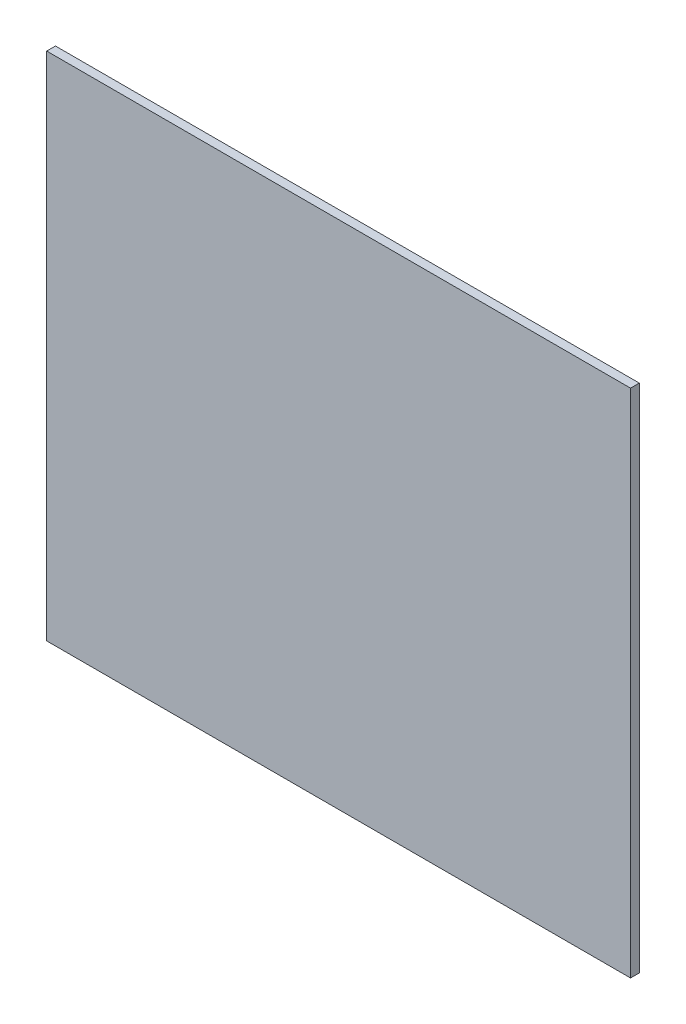
ISO-10303-21;
HEADER;
FILE_DESCRIPTION(('STEP AP214'),'2;1');
FILE_NAME('part.step','',(''),(''),'','','');
FILE_SCHEMA(('AUTOMOTIVE_DESIGN { 1 0 10303 214 1 1 1 1 }'));
ENDSEC;
DATA;
#1=APPLICATION_CONTEXT('core data for automotive mechanical design processes');
#2=APPLICATION_PROTOCOL_DEFINITION('international standard','automotive_design',2000,#1);
#3=PRODUCT_CONTEXT('',#1,'mechanical');
#4=PRODUCT('Part','Part','',(#3));
#5=PRODUCT_RELATED_PRODUCT_CATEGORY('part','',(#4));
#6=PRODUCT_DEFINITION_FORMATION('','',#4);
#7=PRODUCT_DEFINITION_CONTEXT('part definition',#1,'design');
#8=PRODUCT_DEFINITION('design','',#6,#7);
#9=PRODUCT_DEFINITION_SHAPE('','',#8);
#10=(LENGTH_UNIT() NAMED_UNIT(*) SI_UNIT(.MILLI.,.METRE.));
#11=(NAMED_UNIT(*) PLANE_ANGLE_UNIT() SI_UNIT($,.RADIAN.));
#12=(NAMED_UNIT(*) SI_UNIT($,.STERADIAN.) SOLID_ANGLE_UNIT());
#13=UNCERTAINTY_MEASURE_WITH_UNIT(LENGTH_MEASURE(1.E-05),#10,'distance_accuracy_value','');
#14=(GEOMETRIC_REPRESENTATION_CONTEXT(3) GLOBAL_UNCERTAINTY_ASSIGNED_CONTEXT((#13)) GLOBAL_UNIT_ASSIGNED_CONTEXT((#10,
#11,#12)) REPRESENTATION_CONTEXT('',''));
#15=CARTESIAN_POINT('',(0.,0.,0.));
#16=DIRECTION('',(0.,0.,1.));
#17=DIRECTION('',(1.,0.,0.));
#18=AXIS2_PLACEMENT_3D('',#15,#16,#17);
#19=CARTESIAN_POINT('',(0.,0.,0.));
#20=DIRECTION('',(0.,0.,1.));
#21=DIRECTION('',(1.,0.,0.));
#22=AXIS2_PLACEMENT_3D('',#19,#20,#21);
#23=PLANE('',#22);
#24=DIRECTION('',(1.,0.,0.));
#25=VECTOR('',#24,1.);
#26=CARTESIAN_POINT('',(-100.,-87.5,0.));
#27=LINE('',#26,#25);
#28=CARTESIAN_POINT('',(-100.,-87.5,0.));
#29=VERTEX_POINT('',#28);
#30=CARTESIAN_POINT('',(100.,-87.5,0.));
#31=VERTEX_POINT('',#30);
#32=EDGE_CURVE('E25',#29,#31,#27,.T.);
#33=ORIENTED_EDGE('',*,*,#32,.F.);
#34=DIRECTION('',(0.,-1.,0.));
#35=VECTOR('',#34,1.);
#36=CARTESIAN_POINT('',(-100.,87.5,0.));
#37=LINE('',#36,#35);
#38=CARTESIAN_POINT('',(-100.,87.5,0.));
#39=VERTEX_POINT('',#38);
#40=EDGE_CURVE('E86',#39,#29,#37,.T.);
#41=ORIENTED_EDGE('',*,*,#40,.F.);
#42=DIRECTION('',(-1.,0.,0.));
#43=VECTOR('',#42,1.);
#44=CARTESIAN_POINT('',(100.,87.5,0.));
#45=LINE('',#44,#43);
#46=CARTESIAN_POINT('',(100.,87.5,0.));
#47=VERTEX_POINT('',#46);
#48=EDGE_CURVE('E69',#47,#39,#45,.T.);
#49=ORIENTED_EDGE('',*,*,#48,.F.);
#50=DIRECTION('',(0.,1.,0.));
#51=VECTOR('',#50,1.);
#52=CARTESIAN_POINT('',(100.,-87.5,0.));
#53=LINE('',#52,#51);
#54=EDGE_CURVE('E115',#31,#47,#53,.T.);
#55=ORIENTED_EDGE('',*,*,#54,.F.);
#56=EDGE_LOOP('',(#33,#41,#49,#55));
#57=FACE_BOUND('',#56,.T.);
#58=ADVANCED_FACE('F17',(#57),#23,.F.);
#59=CARTESIAN_POINT('',(0.,0.,3.));
#60=DIRECTION('',(0.,0.,1.));
#61=DIRECTION('',(1.,0.,0.));
#62=AXIS2_PLACEMENT_3D('',#59,#60,#61);
#63=PLANE('',#62);
#64=DIRECTION('',(1.,0.,0.));
#65=VECTOR('',#64,1.);
#66=CARTESIAN_POINT('',(-100.,-87.5,3.));
#67=LINE('',#66,#65);
#68=CARTESIAN_POINT('',(-100.,-87.5,3.));
#69=VERTEX_POINT('',#68);
#70=CARTESIAN_POINT('',(100.,-87.5,3.));
#71=VERTEX_POINT('',#70);
#72=EDGE_CURVE('E11',#69,#71,#67,.T.);
#73=ORIENTED_EDGE('',*,*,#72,.T.);
#74=DIRECTION('',(0.,1.,0.));
#75=VECTOR('',#74,1.);
#76=CARTESIAN_POINT('',(100.,-87.5,3.));
#77=LINE('',#76,#75);
#78=CARTESIAN_POINT('',(100.,87.5,3.));
#79=VERTEX_POINT('',#78);
#80=EDGE_CURVE('E108',#71,#79,#77,.T.);
#81=ORIENTED_EDGE('',*,*,#80,.T.);
#82=DIRECTION('',(-1.,0.,0.));
#83=VECTOR('',#82,1.);
#84=CARTESIAN_POINT('',(100.,87.5,3.));
#85=LINE('',#84,#83);
#86=CARTESIAN_POINT('',(-100.,87.5,3.));
#87=VERTEX_POINT('',#86);
#88=EDGE_CURVE('E85',#79,#87,#85,.T.);
#89=ORIENTED_EDGE('',*,*,#88,.T.);
#90=DIRECTION('',(0.,-1.,0.));
#91=VECTOR('',#90,1.);
#92=CARTESIAN_POINT('',(-100.,87.5,3.));
#93=LINE('',#92,#91);
#94=EDGE_CURVE('E90',#87,#69,#93,.T.);
#95=ORIENTED_EDGE('',*,*,#94,.T.);
#96=EDGE_LOOP('',(#73,#81,#89,#95));
#97=FACE_BOUND('',#96,.T.);
#98=ADVANCED_FACE('F119',(#97),#63,.T.);
#99=CARTESIAN_POINT('',(-100.,-87.5,0.));
#100=DIRECTION('',(0.,-1.,0.));
#101=DIRECTION('',(-1.,0.,0.));
#102=AXIS2_PLACEMENT_3D('',#99,#100,#101);
#103=PLANE('',#102);
#104=ORIENTED_EDGE('',*,*,#32,.T.);
#105=DIRECTION('',(0.,0.,1.));
#106=VECTOR('',#105,1.);
#107=CARTESIAN_POINT('',(100.,-87.5,0.));
#108=LINE('',#107,#106);
#109=EDGE_CURVE('E106',#31,#71,#108,.T.);
#110=ORIENTED_EDGE('',*,*,#109,.T.);
#111=ORIENTED_EDGE('',*,*,#72,.F.);
#112=DIRECTION('',(0.,0.,1.));
#113=VECTOR('',#112,1.);
#114=CARTESIAN_POINT('',(-100.,-87.5,0.));
#115=LINE('',#114,#113);
#116=EDGE_CURVE('E91',#29,#69,#115,.T.);
#117=ORIENTED_EDGE('',*,*,#116,.F.);
#118=EDGE_LOOP('',(#104,#110,#111,#117));
#119=FACE_BOUND('',#118,.T.);
#120=ADVANCED_FACE('F121',(#119),#103,.T.);
#121=CARTESIAN_POINT('',(100.,-87.5,0.));
#122=DIRECTION('',(1.,0.,0.));
#123=DIRECTION('',(0.,-1.,0.));
#124=AXIS2_PLACEMENT_3D('',#121,#122,#123);
#125=PLANE('',#124);
#126=ORIENTED_EDGE('',*,*,#54,.T.);
#127=DIRECTION('',(0.,0.,1.));
#128=VECTOR('',#127,1.);
#129=CARTESIAN_POINT('',(100.,87.5,0.));
#130=LINE('',#129,#128);
#131=EDGE_CURVE('E80',#47,#79,#130,.T.);
#132=ORIENTED_EDGE('',*,*,#131,.T.);
#133=ORIENTED_EDGE('',*,*,#80,.F.);
#134=ORIENTED_EDGE('',*,*,#109,.F.);
#135=EDGE_LOOP('',(#126,#132,#133,#134));
#136=FACE_BOUND('',#135,.T.);
#137=ADVANCED_FACE('F120',(#136),#125,.T.);
#138=CARTESIAN_POINT('',(100.,87.5,0.));
#139=DIRECTION('',(0.,1.,0.));
#140=DIRECTION('',(1.,0.,0.));
#141=AXIS2_PLACEMENT_3D('',#138,#139,#140);
#142=PLANE('',#141);
#143=ORIENTED_EDGE('',*,*,#48,.T.);
#144=DIRECTION('',(0.,0.,1.));
#145=VECTOR('',#144,1.);
#146=CARTESIAN_POINT('',(-100.,87.5,0.));
#147=LINE('',#146,#145);
#148=EDGE_CURVE('E72',#39,#87,#147,.T.);
#149=ORIENTED_EDGE('',*,*,#148,.T.);
#150=ORIENTED_EDGE('',*,*,#88,.F.);
#151=ORIENTED_EDGE('',*,*,#131,.F.);
#152=EDGE_LOOP('',(#143,#149,#150,#151));
#153=FACE_BOUND('',#152,.T.);
#154=ADVANCED_FACE('F71',(#153),#142,.T.);
#155=CARTESIAN_POINT('',(-100.,87.5,0.));
#156=DIRECTION('',(-1.,0.,0.));
#157=DIRECTION('',(0.,0.,1.));
#158=AXIS2_PLACEMENT_3D('',#155,#156,#157);
#159=PLANE('',#158);
#160=ORIENTED_EDGE('',*,*,#40,.T.);
#161=ORIENTED_EDGE('',*,*,#116,.T.);
#162=ORIENTED_EDGE('',*,*,#94,.F.);
#163=ORIENTED_EDGE('',*,*,#148,.F.);
#164=EDGE_LOOP('',(#160,#161,#162,#163));
#165=FACE_BOUND('',#164,.T.);
#166=ADVANCED_FACE('F88',(#165),#159,.T.);
#167=CLOSED_SHELL('',(#58,#98,#120,#137,#154,#166));
#168=MANIFOLD_SOLID_BREP('B1',#167);
#169=ADVANCED_BREP_SHAPE_REPRESENTATION('',(#18,#168),#14);
#170=SHAPE_DEFINITION_REPRESENTATION(#9,#169);
ENDSEC;
END-ISO-10303-21;
